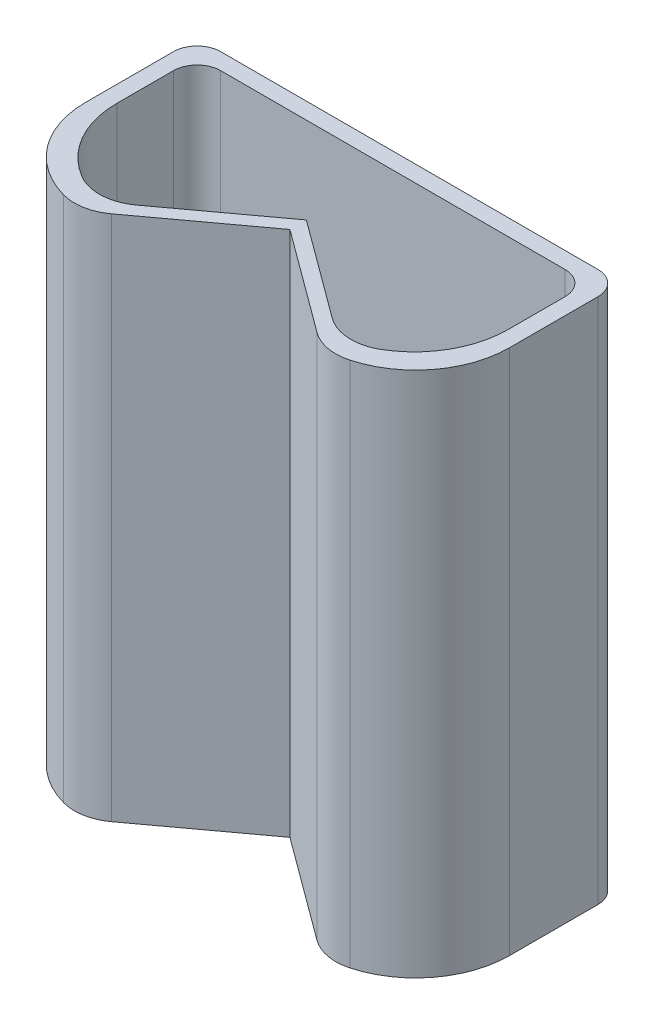
ISO-10303-21;
HEADER;
FILE_DESCRIPTION(('STEP AP214'),'2;1');
FILE_NAME('part.step','',(''),(''),'','','');
FILE_SCHEMA(('AUTOMOTIVE_DESIGN { 1 0 10303 214 1 1 1 1 }'));
ENDSEC;
DATA;
#1=APPLICATION_CONTEXT('core data for automotive mechanical design processes');
#2=APPLICATION_PROTOCOL_DEFINITION('international standard','automotive_design',2000,#1);
#3=PRODUCT_CONTEXT('',#1,'mechanical');
#4=PRODUCT('Part','Part','',(#3));
#5=PRODUCT_RELATED_PRODUCT_CATEGORY('part','',(#4));
#6=PRODUCT_DEFINITION_FORMATION('','',#4);
#7=PRODUCT_DEFINITION_CONTEXT('part definition',#1,'design');
#8=PRODUCT_DEFINITION('design','',#6,#7);
#9=PRODUCT_DEFINITION_SHAPE('','',#8);
#10=(LENGTH_UNIT() NAMED_UNIT(*) SI_UNIT(.MILLI.,.METRE.));
#11=(NAMED_UNIT(*) PLANE_ANGLE_UNIT() SI_UNIT($,.RADIAN.));
#12=(NAMED_UNIT(*) SI_UNIT($,.STERADIAN.) SOLID_ANGLE_UNIT());
#13=UNCERTAINTY_MEASURE_WITH_UNIT(LENGTH_MEASURE(1.E-05),#10,'distance_accuracy_value','');
#14=(GEOMETRIC_REPRESENTATION_CONTEXT(3) GLOBAL_UNCERTAINTY_ASSIGNED_CONTEXT((#13)) GLOBAL_UNIT_ASSIGNED_CONTEXT((#10,
#11,#12)) REPRESENTATION_CONTEXT('',''));
#15=CARTESIAN_POINT('',(0.,0.,0.));
#16=DIRECTION('',(0.,0.,1.));
#17=DIRECTION('',(1.,0.,0.));
#18=AXIS2_PLACEMENT_3D('',#15,#16,#17);
#19=CARTESIAN_POINT('',(-4.515,5.6,4.38));
#20=DIRECTION('',(0.,-1.,0.));
#21=DIRECTION('',(0.,0.,-1.));
#22=AXIS2_PLACEMENT_3D('',#19,#20,#21);
#23=PLANE('',#22);
#24=DIRECTION('',(0.805379604303526,0.,0.592759388767395));
#25=VECTOR('',#24,1.);
#26=CARTESIAN_POINT('',(-1.04549794512018,5.6,1.42051351239155));
#27=LINE('',#26,#25);
#28=CARTESIAN_POINT('',(0.,5.6,2.19));
#29=VERTEX_POINT('',#28);
#30=CARTESIAN_POINT('',(2.08320383743881,5.6,3.72323802435497));
#31=VERTEX_POINT('',#30);
#32=EDGE_CURVE('E250',#29,#31,#27,.T.);
#33=ORIENTED_EDGE('',*,*,#32,.F.);
#34=DIRECTION('',(0.805379604303526,0.,-0.592759388767395));
#35=VECTOR('',#34,1.);
#36=CARTESIAN_POINT('',(1.04549794512018,5.6,1.42051351239155));
#37=LINE('',#36,#35);
#38=CARTESIAN_POINT('',(-2.08320383743881,5.6,3.72323802435497));
#39=VERTEX_POINT('',#38);
#40=EDGE_CURVE('E247',#39,#29,#37,.T.);
#41=ORIENTED_EDGE('',*,*,#40,.F.);
#42=CARTESIAN_POINT('',(-2.67596322620621,5.6,2.91785842005144));
#43=DIRECTION('',(0.,-1.,0.));
#44=DIRECTION('',(0.,0.,-1.));
#45=AXIS2_PLACEMENT_3D('',#42,#43,#44);
#46=CIRCLE('',#45,1.);
#47=CARTESIAN_POINT('',(-3.18692645241241,5.6,3.77746099186294));
#48=VERTEX_POINT('',#47);
#49=EDGE_CURVE('E425',#39,#48,#46,.T.);
#50=ORIENTED_EDGE('',*,*,#49,.T.);
#51=CARTESIAN_POINT('',(-2.165,5.6,2.05825584823994));
#52=DIRECTION('',(0.,-1.,0.));
#53=DIRECTION('',(0.,0.,-1.));
#54=AXIS2_PLACEMENT_3D('',#51,#52,#53);
#55=CIRCLE('',#54,2.);
#56=CARTESIAN_POINT('',(-4.165,5.6,2.05825584823994));
#57=VERTEX_POINT('',#56);
#58=EDGE_CURVE('E362',#48,#57,#55,.T.);
#59=ORIENTED_EDGE('',*,*,#58,.T.);
#60=DIRECTION('',(0.,0.,-1.));
#61=VECTOR('',#60,1.);
#62=CARTESIAN_POINT('',(-4.165,5.6,0.));
#63=LINE('',#62,#61);
#64=CARTESIAN_POINT('',(-4.165,5.6,0.85));
#65=VERTEX_POINT('',#64);
#66=EDGE_CURVE('E263',#57,#65,#63,.T.);
#67=ORIENTED_EDGE('',*,*,#66,.T.);
#68=CARTESIAN_POINT('',(-3.665,5.6,0.85));
#69=DIRECTION('',(0.,-1.,0.));
#70=DIRECTION('',(0.,0.,-1.));
#71=AXIS2_PLACEMENT_3D('',#68,#69,#70);
#72=CIRCLE('',#71,0.5);
#73=CARTESIAN_POINT('',(-3.665,5.6,0.35));
#74=VERTEX_POINT('',#73);
#75=EDGE_CURVE('E79',#65,#74,#72,.T.);
#76=ORIENTED_EDGE('',*,*,#75,.T.);
#77=DIRECTION('',(1.,0.,0.));
#78=VECTOR('',#77,1.);
#79=CARTESIAN_POINT('',(0.,5.6,0.35));
#80=LINE('',#79,#78);
#81=CARTESIAN_POINT('',(3.665,5.6,0.35));
#82=VERTEX_POINT('',#81);
#83=EDGE_CURVE('E259',#74,#82,#80,.T.);
#84=ORIENTED_EDGE('',*,*,#83,.T.);
#85=CARTESIAN_POINT('',(3.665,5.6,0.85));
#86=DIRECTION('',(0.,-1.,0.));
#87=DIRECTION('',(0.,0.,-1.));
#88=AXIS2_PLACEMENT_3D('',#85,#86,#87);
#89=CIRCLE('',#88,0.5);
#90=CARTESIAN_POINT('',(4.165,5.6,0.85));
#91=VERTEX_POINT('',#90);
#92=EDGE_CURVE('E444',#82,#91,#89,.T.);
#93=ORIENTED_EDGE('',*,*,#92,.T.);
#94=DIRECTION('',(0.,0.,1.));
#95=VECTOR('',#94,1.);
#96=CARTESIAN_POINT('',(4.165,5.6,0.));
#97=LINE('',#96,#95);
#98=CARTESIAN_POINT('',(4.165,5.6,2.05825584823994));
#99=VERTEX_POINT('',#98);
#100=EDGE_CURVE('E256',#91,#99,#97,.T.);
#101=ORIENTED_EDGE('',*,*,#100,.T.);
#102=CARTESIAN_POINT('',(2.165,5.6,2.05825584823994));
#103=DIRECTION('',(0.,-1.,0.));
#104=DIRECTION('',(0.,0.,-1.));
#105=AXIS2_PLACEMENT_3D('',#102,#103,#104);
#106=CIRCLE('',#105,2.);
#107=CARTESIAN_POINT('',(3.18692645241241,5.6,3.77746099186294));
#108=VERTEX_POINT('',#107);
#109=EDGE_CURVE('E354',#99,#108,#106,.T.);
#110=ORIENTED_EDGE('',*,*,#109,.T.);
#111=CARTESIAN_POINT('',(2.67596322620621,5.6,2.91785842005144));
#112=DIRECTION('',(0.,-1.,0.));
#113=DIRECTION('',(0.,0.,-1.));
#114=AXIS2_PLACEMENT_3D('',#111,#112,#113);
#115=CIRCLE('',#114,1.);
#116=EDGE_CURVE('E419',#108,#31,#115,.T.);
#117=ORIENTED_EDGE('',*,*,#116,.T.);
#118=EDGE_LOOP('',(#33,#41,#50,#59,#67,#76,#84,#93,#101,#110,#117));
#119=FACE_BOUND('',#118,.T.);
#120=DIRECTION('',(-0.805379604303527,0.,-0.592759388767395));
#121=VECTOR('',#120,1.);
#122=CARTESIAN_POINT('',(-1.21258665781062,5.6,1.64753621985139));
#123=LINE('',#122,#121);
#124=CARTESIAN_POINT('',(2.18706145914825,5.6,4.14967723393311));
#125=VERTEX_POINT('',#124);
#126=CARTESIAN_POINT('',(0.,5.6,2.54));
#127=VERTEX_POINT('',#126);
#128=EDGE_CURVE('E222',#125,#127,#123,.T.);
#129=ORIENTED_EDGE('',*,*,#128,.F.);
#130=CARTESIAN_POINT('',(2.77982084791565,5.6,3.34429762962959));
#131=DIRECTION('',(0.,-1.,0.));
#132=DIRECTION('',(0.,0.,-1.));
#133=AXIS2_PLACEMENT_3D('',#130,#131,#132);
#134=CIRCLE('',#133,1.);
#135=CARTESIAN_POINT('',(3.0446416958313,5.6,4.30859525925917));
#136=VERTEX_POINT('',#135);
#137=EDGE_CURVE('E403',#125,#136,#134,.F.);
#138=ORIENTED_EDGE('',*,*,#137,.T.);
#139=CARTESIAN_POINT('',(2.515,5.6,2.38));
#140=DIRECTION('',(0.,-1.,0.));
#141=DIRECTION('',(0.,0.,-1.));
#142=AXIS2_PLACEMENT_3D('',#139,#140,#141);
#143=CIRCLE('',#142,2.);
#144=CARTESIAN_POINT('',(4.515,5.6,2.38));
#145=VERTEX_POINT('',#144);
#146=EDGE_CURVE('E372',#136,#145,#143,.F.);
#147=ORIENTED_EDGE('',*,*,#146,.T.);
#148=DIRECTION('',(0.,0.,-1.));
#149=VECTOR('',#148,1.);
#150=CARTESIAN_POINT('',(4.515,5.6,4.38));
#151=LINE('',#150,#149);
#152=CARTESIAN_POINT('',(4.515,5.6,0.5));
#153=VERTEX_POINT('',#152);
#154=EDGE_CURVE('E293',#145,#153,#151,.T.);
#155=ORIENTED_EDGE('',*,*,#154,.T.);
#156=CARTESIAN_POINT('',(4.015,5.6,0.5));
#157=DIRECTION('',(0.,-1.,0.));
#158=DIRECTION('',(0.,0.,-1.));
#159=AXIS2_PLACEMENT_3D('',#156,#157,#158);
#160=CIRCLE('',#159,0.5);
#161=CARTESIAN_POINT('',(4.015,5.6,0.));
#162=VERTEX_POINT('',#161);
#163=EDGE_CURVE('E304',#153,#162,#160,.F.);
#164=ORIENTED_EDGE('',*,*,#163,.T.);
#165=DIRECTION('',(-1.,0.,0.));
#166=VECTOR('',#165,1.);
#167=CARTESIAN_POINT('',(-4.515,5.6,0.));
#168=LINE('',#167,#166);
#169=CARTESIAN_POINT('',(-4.015,5.6,0.));
#170=VERTEX_POINT('',#169);
#171=EDGE_CURVE('E276',#162,#170,#168,.T.);
#172=ORIENTED_EDGE('',*,*,#171,.T.);
#173=CARTESIAN_POINT('',(-4.015,5.6,0.5));
#174=DIRECTION('',(0.,-1.,0.));
#175=DIRECTION('',(0.,0.,-1.));
#176=AXIS2_PLACEMENT_3D('',#173,#174,#175);
#177=CIRCLE('',#176,0.5);
#178=CARTESIAN_POINT('',(-4.515,5.6,0.5));
#179=VERTEX_POINT('',#178);
#180=EDGE_CURVE('E300',#170,#179,#177,.F.);
#181=ORIENTED_EDGE('',*,*,#180,.T.);
#182=DIRECTION('',(0.,0.,-1.));
#183=VECTOR('',#182,1.);
#184=CARTESIAN_POINT('',(-4.515,5.6,4.38));
#185=LINE('',#184,#183);
#186=CARTESIAN_POINT('',(-4.515,5.6,2.38));
#187=VERTEX_POINT('',#186);
#188=EDGE_CURVE('E290',#187,#179,#185,.T.);
#189=ORIENTED_EDGE('',*,*,#188,.F.);
#190=CARTESIAN_POINT('',(-2.515,5.6,2.38));
#191=DIRECTION('',(0.,-1.,0.));
#192=DIRECTION('',(0.,0.,-1.));
#193=AXIS2_PLACEMENT_3D('',#190,#191,#192);
#194=CIRCLE('',#193,2.);
#195=CARTESIAN_POINT('',(-3.04464169583129,5.6,4.30859525925917));
#196=VERTEX_POINT('',#195);
#197=EDGE_CURVE('E369',#187,#196,#194,.F.);
#198=ORIENTED_EDGE('',*,*,#197,.T.);
#199=CARTESIAN_POINT('',(-2.77982084791565,5.6,3.34429762962959));
#200=DIRECTION('',(0.,-1.,0.));
#201=DIRECTION('',(0.,0.,-1.));
#202=AXIS2_PLACEMENT_3D('',#199,#200,#201);
#203=CIRCLE('',#202,1.);
#204=CARTESIAN_POINT('',(-2.18706145914825,5.6,4.14967723393311));
#205=VERTEX_POINT('',#204);
#206=EDGE_CURVE('E226',#196,#205,#203,.F.);
#207=ORIENTED_EDGE('',*,*,#206,.T.);
#208=DIRECTION('',(0.805379604303526,0.,-0.592759388767395));
#209=VECTOR('',#208,1.);
#210=CARTESIAN_POINT('',(1.21258665781062,5.6,1.64753621985138));
#211=LINE('',#210,#209);
#212=EDGE_CURVE('E220',#205,#127,#211,.T.);
#213=ORIENTED_EDGE('',*,*,#212,.T.);
#214=EDGE_LOOP('',(#129,#138,#147,#155,#164,#172,#181,#189,#198,#207,#213));
#215=FACE_BOUND('',#214,.T.);
#216=ADVANCED_FACE('F70',(#119,#215),#23,.F.);
#217=CARTESIAN_POINT('',(-4.515,-5.6,4.38));
#218=DIRECTION('',(0.,1.,0.));
#219=DIRECTION('',(0.,0.,1.));
#220=AXIS2_PLACEMENT_3D('',#217,#218,#219);
#221=PLANE('',#220);
#222=DIRECTION('',(0.,0.,-1.));
#223=VECTOR('',#222,1.);
#224=CARTESIAN_POINT('',(-4.165,-5.6,4.38));
#225=LINE('',#224,#223);
#226=CARTESIAN_POINT('',(-4.165,-5.6,2.05825584823994));
#227=VERTEX_POINT('',#226);
#228=CARTESIAN_POINT('',(-4.165,-5.6,0.85));
#229=VERTEX_POINT('',#228);
#230=EDGE_CURVE('E335',#227,#229,#225,.T.);
#231=ORIENTED_EDGE('',*,*,#230,.F.);
#232=CARTESIAN_POINT('',(-2.165,-5.6,2.05825584823994));
#233=DIRECTION('',(0.,1.,0.));
#234=DIRECTION('',(0.,0.,1.));
#235=AXIS2_PLACEMENT_3D('',#232,#233,#234);
#236=CIRCLE('',#235,2.);
#237=CARTESIAN_POINT('',(-3.18692645241241,-5.6,3.77746099186294));
#238=VERTEX_POINT('',#237);
#239=EDGE_CURVE('E365',#227,#238,#236,.T.);
#240=ORIENTED_EDGE('',*,*,#239,.T.);
#241=CARTESIAN_POINT('',(-2.67596322620621,-5.6,2.91785842005144));
#242=DIRECTION('',(0.,1.,0.));
#243=DIRECTION('',(0.,0.,1.));
#244=AXIS2_PLACEMENT_3D('',#241,#242,#243);
#245=CIRCLE('',#244,1.);
#246=CARTESIAN_POINT('',(-2.08320383743881,-5.6,3.72323802435497));
#247=VERTEX_POINT('',#246);
#248=EDGE_CURVE('E428',#238,#247,#245,.T.);
#249=ORIENTED_EDGE('',*,*,#248,.T.);
#250=DIRECTION('',(0.805379604303526,0.,-0.592759388767395));
#251=VECTOR('',#250,1.);
#252=CARTESIAN_POINT('',(-3.97409087135207,-5.6,5.11493088131512));
#253=LINE('',#252,#251);
#254=CARTESIAN_POINT('',(0.,-5.6,2.19));
#255=VERTEX_POINT('',#254);
#256=EDGE_CURVE('E338',#247,#255,#253,.T.);
#257=ORIENTED_EDGE('',*,*,#256,.T.);
#258=DIRECTION('',(0.805379604303526,0.,0.592759388767395));
#259=VECTOR('',#258,1.);
#260=CARTESIAN_POINT('',(-1.88309498111171,-5.6,0.80404209390178));
#261=LINE('',#260,#259);
#262=CARTESIAN_POINT('',(2.08320383743881,-5.6,3.72323802435497));
#263=VERTEX_POINT('',#262);
#264=EDGE_CURVE('E324',#255,#263,#261,.T.);
#265=ORIENTED_EDGE('',*,*,#264,.T.);
#266=CARTESIAN_POINT('',(2.67596322620621,-5.6,2.91785842005144));
#267=DIRECTION('',(0.,1.,0.));
#268=DIRECTION('',(0.,0.,1.));
#269=AXIS2_PLACEMENT_3D('',#266,#267,#268);
#270=CIRCLE('',#269,1.);
#271=CARTESIAN_POINT('',(3.18692645241241,-5.6,3.77746099186294));
#272=VERTEX_POINT('',#271);
#273=EDGE_CURVE('E422',#263,#272,#270,.T.);
#274=ORIENTED_EDGE('',*,*,#273,.T.);
#275=CARTESIAN_POINT('',(2.165,-5.6,2.05825584823994));
#276=DIRECTION('',(0.,1.,0.));
#277=DIRECTION('',(0.,0.,1.));
#278=AXIS2_PLACEMENT_3D('',#275,#276,#277);
#279=CIRCLE('',#278,2.);
#280=CARTESIAN_POINT('',(4.165,-5.6,2.05825584823994));
#281=VERTEX_POINT('',#280);
#282=EDGE_CURVE('E358',#272,#281,#279,.T.);
#283=ORIENTED_EDGE('',*,*,#282,.T.);
#284=DIRECTION('',(0.,0.,1.));
#285=VECTOR('',#284,1.);
#286=CARTESIAN_POINT('',(4.165,-5.6,4.38));
#287=LINE('',#286,#285);
#288=CARTESIAN_POINT('',(4.165,-5.6,0.85));
#289=VERTEX_POINT('',#288);
#290=EDGE_CURVE('E328',#289,#281,#287,.T.);
#291=ORIENTED_EDGE('',*,*,#290,.F.);
#292=CARTESIAN_POINT('',(3.665,-5.6,0.85));
#293=DIRECTION('',(0.,1.,0.));
#294=DIRECTION('',(0.,0.,1.));
#295=AXIS2_PLACEMENT_3D('',#292,#293,#294);
#296=CIRCLE('',#295,0.5);
#297=CARTESIAN_POINT('',(3.665,-5.6,0.35));
#298=VERTEX_POINT('',#297);
#299=EDGE_CURVE('E447',#289,#298,#296,.T.);
#300=ORIENTED_EDGE('',*,*,#299,.T.);
#301=DIRECTION('',(1.,0.,0.));
#302=VECTOR('',#301,1.);
#303=CARTESIAN_POINT('',(-4.515,-5.6,0.35));
#304=LINE('',#303,#302);
#305=CARTESIAN_POINT('',(-3.665,-5.6,0.35));
#306=VERTEX_POINT('',#305);
#307=EDGE_CURVE('E331',#306,#298,#304,.T.);
#308=ORIENTED_EDGE('',*,*,#307,.F.);
#309=CARTESIAN_POINT('',(-3.665,-5.6,0.85));
#310=DIRECTION('',(0.,1.,0.));
#311=DIRECTION('',(0.,0.,1.));
#312=AXIS2_PLACEMENT_3D('',#309,#310,#311);
#313=CIRCLE('',#312,0.5);
#314=EDGE_CURVE('E12',#306,#229,#313,.T.);
#315=ORIENTED_EDGE('',*,*,#314,.T.);
#316=EDGE_LOOP('',(#231,#240,#249,#257,#265,#274,#283,#291,#300,#308,#315));
#317=FACE_BOUND('',#316,.T.);
#318=CARTESIAN_POINT('',(2.515,-5.6,2.38));
#319=DIRECTION('',(0.,1.,0.));
#320=DIRECTION('',(0.,0.,1.));
#321=AXIS2_PLACEMENT_3D('',#318,#319,#320);
#322=CIRCLE('',#321,2.);
#323=CARTESIAN_POINT('',(4.515,-5.6,2.38));
#324=VERTEX_POINT('',#323);
#325=CARTESIAN_POINT('',(3.0446416958313,-5.6,4.30859525925917));
#326=VERTEX_POINT('',#325);
#327=EDGE_CURVE('E378',#324,#326,#322,.F.);
#328=ORIENTED_EDGE('',*,*,#327,.T.);
#329=CARTESIAN_POINT('',(2.77982084791565,-5.6,3.34429762962959));
#330=DIRECTION('',(0.,1.,0.));
#331=DIRECTION('',(0.,0.,1.));
#332=AXIS2_PLACEMENT_3D('',#329,#330,#331);
#333=CIRCLE('',#332,1.);
#334=CARTESIAN_POINT('',(2.18706145914825,-5.6,4.14967723393311));
#335=VERTEX_POINT('',#334);
#336=EDGE_CURVE('E396',#326,#335,#333,.F.);
#337=ORIENTED_EDGE('',*,*,#336,.T.);
#338=DIRECTION('',(-0.805379604303527,0.,-0.592759388767395));
#339=VECTOR('',#338,1.);
#340=CARTESIAN_POINT('',(-2.05018369380215,-5.6,1.03106480136162));
#341=LINE('',#340,#339);
#342=CARTESIAN_POINT('',(0.,-5.6,2.54));
#343=VERTEX_POINT('',#342);
#344=EDGE_CURVE('E271',#335,#343,#341,.T.);
#345=ORIENTED_EDGE('',*,*,#344,.T.);
#346=DIRECTION('',(0.805379604303526,0.,-0.592759388767395));
#347=VECTOR('',#346,1.);
#348=CARTESIAN_POINT('',(-3.80700215866163,-5.6,5.34195358877496));
#349=LINE('',#348,#347);
#350=CARTESIAN_POINT('',(-2.18706145914825,-5.6,4.14967723393311));
#351=VERTEX_POINT('',#350);
#352=EDGE_CURVE('E244',#351,#343,#349,.T.);
#353=ORIENTED_EDGE('',*,*,#352,.F.);
#354=CARTESIAN_POINT('',(-2.77982084791565,-5.6,3.34429762962959));
#355=DIRECTION('',(0.,1.,0.));
#356=DIRECTION('',(0.,0.,1.));
#357=AXIS2_PLACEMENT_3D('',#354,#355,#356);
#358=CIRCLE('',#357,1.);
#359=CARTESIAN_POINT('',(-3.04464169583129,-5.6,4.30859525925917));
#360=VERTEX_POINT('',#359);
#361=EDGE_CURVE('E393',#351,#360,#358,.F.);
#362=ORIENTED_EDGE('',*,*,#361,.T.);
#363=CARTESIAN_POINT('',(-2.515,-5.6,2.38));
#364=DIRECTION('',(0.,1.,0.));
#365=DIRECTION('',(0.,0.,1.));
#366=AXIS2_PLACEMENT_3D('',#363,#364,#365);
#367=CIRCLE('',#366,2.);
#368=CARTESIAN_POINT('',(-4.515,-5.6,2.38));
#369=VERTEX_POINT('',#368);
#370=EDGE_CURVE('E375',#360,#369,#367,.F.);
#371=ORIENTED_EDGE('',*,*,#370,.T.);
#372=DIRECTION('',(0.,0.,-1.));
#373=VECTOR('',#372,1.);
#374=CARTESIAN_POINT('',(-4.515,-5.6,4.38));
#375=LINE('',#374,#373);
#376=CARTESIAN_POINT('',(-4.515,-5.6,0.5));
#377=VERTEX_POINT('',#376);
#378=EDGE_CURVE('E287',#369,#377,#375,.T.);
#379=ORIENTED_EDGE('',*,*,#378,.T.);
#380=CARTESIAN_POINT('',(-4.015,-5.6,0.5));
#381=DIRECTION('',(0.,1.,0.));
#382=DIRECTION('',(0.,0.,1.));
#383=AXIS2_PLACEMENT_3D('',#380,#381,#382);
#384=CIRCLE('',#383,0.5);
#385=CARTESIAN_POINT('',(-4.015,-5.6,0.));
#386=VERTEX_POINT('',#385);
#387=EDGE_CURVE('E313',#377,#386,#384,.F.);
#388=ORIENTED_EDGE('',*,*,#387,.T.);
#389=DIRECTION('',(1.,0.,0.));
#390=VECTOR('',#389,1.);
#391=CARTESIAN_POINT('',(-4.515,-5.6,0.));
#392=LINE('',#391,#390);
#393=CARTESIAN_POINT('',(4.015,-5.6,0.));
#394=VERTEX_POINT('',#393);
#395=EDGE_CURVE('E280',#386,#394,#392,.T.);
#396=ORIENTED_EDGE('',*,*,#395,.T.);
#397=CARTESIAN_POINT('',(4.015,-5.6,0.5));
#398=DIRECTION('',(0.,1.,0.));
#399=DIRECTION('',(0.,0.,1.));
#400=AXIS2_PLACEMENT_3D('',#397,#398,#399);
#401=CIRCLE('',#400,0.5);
#402=CARTESIAN_POINT('',(4.515,-5.6,0.5));
#403=VERTEX_POINT('',#402);
#404=EDGE_CURVE('E316',#394,#403,#401,.F.);
#405=ORIENTED_EDGE('',*,*,#404,.T.);
#406=DIRECTION('',(0.,0.,-1.));
#407=VECTOR('',#406,1.);
#408=CARTESIAN_POINT('',(4.515,-5.6,4.38));
#409=LINE('',#408,#407);
#410=EDGE_CURVE('E284',#324,#403,#409,.T.);
#411=ORIENTED_EDGE('',*,*,#410,.F.);
#412=EDGE_LOOP('',(#328,#337,#345,#353,#362,#371,#379,#388,#396,#405,#411));
#413=FACE_BOUND('',#412,.T.);
#414=ADVANCED_FACE('F461',(#317,#413),#221,.F.);
#415=CARTESIAN_POINT('',(4.515,-5.6,4.38));
#416=DIRECTION('',(-1.,0.,0.));
#417=DIRECTION('',(0.,0.,1.));
#418=AXIS2_PLACEMENT_3D('',#415,#416,#417);
#419=PLANE('',#418);
#420=ORIENTED_EDGE('',*,*,#154,.F.);
#421=DIRECTION('',(0.,1.,0.));
#422=VECTOR('',#421,1.);
#423=CARTESIAN_POINT('',(4.515,-5.6,2.38));
#424=LINE('',#423,#422);
#425=EDGE_CURVE('E345',#145,#324,#424,.F.);
#426=ORIENTED_EDGE('',*,*,#425,.T.);
#427=ORIENTED_EDGE('',*,*,#410,.T.);
#428=DIRECTION('',(0.,1.,0.));
#429=VECTOR('',#428,1.);
#430=CARTESIAN_POINT('',(4.515,5.6,0.5));
#431=LINE('',#430,#429);
#432=EDGE_CURVE('E296',#403,#153,#431,.T.);
#433=ORIENTED_EDGE('',*,*,#432,.T.);
#434=EDGE_LOOP('',(#420,#426,#427,#433));
#435=FACE_BOUND('',#434,.T.);
#436=ADVANCED_FACE('F510',(#435),#419,.F.);
#437=CARTESIAN_POINT('',(-4.515,-5.6,4.38));
#438=DIRECTION('',(1.,0.,0.));
#439=DIRECTION('',(0.,0.,-1.));
#440=AXIS2_PLACEMENT_3D('',#437,#438,#439);
#441=PLANE('',#440);
#442=ORIENTED_EDGE('',*,*,#378,.F.);
#443=DIRECTION('',(0.,-1.,0.));
#444=VECTOR('',#443,1.);
#445=CARTESIAN_POINT('',(-4.515,-5.6,2.38));
#446=LINE('',#445,#444);
#447=EDGE_CURVE('E351',#369,#187,#446,.F.);
#448=ORIENTED_EDGE('',*,*,#447,.T.);
#449=ORIENTED_EDGE('',*,*,#188,.T.);
#450=DIRECTION('',(0.,-1.,0.));
#451=VECTOR('',#450,1.);
#452=CARTESIAN_POINT('',(-4.515,-5.6,0.5));
#453=LINE('',#452,#451);
#454=EDGE_CURVE('E320',#179,#377,#453,.T.);
#455=ORIENTED_EDGE('',*,*,#454,.T.);
#456=EDGE_LOOP('',(#442,#448,#449,#455));
#457=FACE_BOUND('',#456,.T.);
#458=ADVANCED_FACE('F514',(#457),#441,.F.);
#459=CARTESIAN_POINT('',(0.,0.,0.));
#460=DIRECTION('',(0.,0.,-1.));
#461=DIRECTION('',(-1.,0.,0.));
#462=AXIS2_PLACEMENT_3D('',#459,#460,#461);
#463=PLANE('',#462);
#464=ORIENTED_EDGE('',*,*,#171,.F.);
#465=DIRECTION('',(0.,1.,0.));
#466=VECTOR('',#465,1.);
#467=CARTESIAN_POINT('',(4.015,-5.6,0.));
#468=LINE('',#467,#466);
#469=EDGE_CURVE('E310',#162,#394,#468,.F.);
#470=ORIENTED_EDGE('',*,*,#469,.T.);
#471=ORIENTED_EDGE('',*,*,#395,.F.);
#472=DIRECTION('',(0.,-1.,0.));
#473=VECTOR('',#472,1.);
#474=CARTESIAN_POINT('',(-4.015,5.6,0.));
#475=LINE('',#474,#473);
#476=EDGE_CURVE('E307',#386,#170,#475,.F.);
#477=ORIENTED_EDGE('',*,*,#476,.T.);
#478=EDGE_LOOP('',(#464,#470,#471,#477));
#479=FACE_BOUND('',#478,.T.);
#480=ADVANCED_FACE('F522',(#479),#463,.T.);
#481=CARTESIAN_POINT('',(4.015,-5.6,0.5));
#482=DIRECTION('',(0.,-1.,0.));
#483=DIRECTION('',(0.,0.,-1.));
#484=AXIS2_PLACEMENT_3D('',#481,#482,#483);
#485=CYLINDRICAL_SURFACE('',#484,0.5);
#486=ORIENTED_EDGE('',*,*,#404,.F.);
#487=ORIENTED_EDGE('',*,*,#469,.F.);
#488=ORIENTED_EDGE('',*,*,#163,.F.);
#489=ORIENTED_EDGE('',*,*,#432,.F.);
#490=EDGE_LOOP('',(#486,#487,#488,#489));
#491=FACE_BOUND('',#490,.T.);
#492=ADVANCED_FACE('F518',(#491),#485,.T.);
#493=CARTESIAN_POINT('',(-4.015,-5.6,0.5));
#494=DIRECTION('',(0.,1.,0.));
#495=DIRECTION('',(0.,0.,1.));
#496=AXIS2_PLACEMENT_3D('',#493,#494,#495);
#497=CYLINDRICAL_SURFACE('',#496,0.5);
#498=ORIENTED_EDGE('',*,*,#180,.F.);
#499=ORIENTED_EDGE('',*,*,#476,.F.);
#500=ORIENTED_EDGE('',*,*,#387,.F.);
#501=ORIENTED_EDGE('',*,*,#454,.F.);
#502=EDGE_LOOP('',(#498,#499,#500,#501));
#503=FACE_BOUND('',#502,.T.);
#504=ADVANCED_FACE('F521',(#503),#497,.T.);
#505=CARTESIAN_POINT('',(1.21258665781062,-8.78,1.64753621985138));
#506=DIRECTION('',(0.592759388767395,0.,0.805379604303526));
#507=DIRECTION('',(0.805379604303526,0.,-0.592759388767395));
#508=AXIS2_PLACEMENT_3D('',#505,#506,#507);
#509=PLANE('',#508);
#510=ORIENTED_EDGE('',*,*,#212,.F.);
#511=DIRECTION('',(0.,-1.,0.));
#512=VECTOR('',#511,1.);
#513=CARTESIAN_POINT('',(-2.18706145914825,-8.78,4.14967723393311));
#514=LINE('',#513,#512);
#515=EDGE_CURVE('E406',#205,#351,#514,.T.);
#516=ORIENTED_EDGE('',*,*,#515,.T.);
#517=ORIENTED_EDGE('',*,*,#352,.T.);
#518=DIRECTION('',(0.,1.,0.));
#519=VECTOR('',#518,1.);
#520=CARTESIAN_POINT('',(0.,-8.78,2.54));
#521=LINE('',#520,#519);
#522=EDGE_CURVE('E232',#343,#127,#521,.T.);
#523=ORIENTED_EDGE('',*,*,#522,.T.);
#524=EDGE_LOOP('',(#510,#516,#517,#523));
#525=FACE_BOUND('',#524,.T.);
#526=ADVANCED_FACE('F242',(#525),#509,.T.);
#527=CARTESIAN_POINT('',(-1.21258665781062,-8.78,1.64753621985139));
#528=DIRECTION('',(0.592759388767395,0.,-0.805379604303526));
#529=DIRECTION('',(-0.805379604303527,0.,-0.592759388767395));
#530=AXIS2_PLACEMENT_3D('',#527,#528,#529);
#531=PLANE('',#530);
#532=ORIENTED_EDGE('',*,*,#344,.F.);
#533=DIRECTION('',(0.,-1.,0.));
#534=VECTOR('',#533,1.);
#535=CARTESIAN_POINT('',(2.18706145914825,5.6,4.14967723393311));
#536=LINE('',#535,#534);
#537=EDGE_CURVE('E239',#335,#125,#536,.F.);
#538=ORIENTED_EDGE('',*,*,#537,.T.);
#539=ORIENTED_EDGE('',*,*,#128,.T.);
#540=ORIENTED_EDGE('',*,*,#522,.F.);
#541=EDGE_LOOP('',(#532,#538,#539,#540));
#542=FACE_BOUND('',#541,.T.);
#543=ADVANCED_FACE('F237',(#542),#531,.F.);
#544=CARTESIAN_POINT('',(1.04549794512018,-8.78,1.42051351239155));
#545=DIRECTION('',(0.592759388767395,0.,0.805379604303526));
#546=DIRECTION('',(0.805379604303526,0.,-0.592759388767395));
#547=AXIS2_PLACEMENT_3D('',#544,#545,#546);
#548=PLANE('',#547);
#549=ORIENTED_EDGE('',*,*,#256,.F.);
#550=DIRECTION('',(0.,1.,0.));
#551=VECTOR('',#550,1.);
#552=CARTESIAN_POINT('',(-2.08320383743881,5.6,3.72323802435497));
#553=LINE('',#552,#551);
#554=EDGE_CURVE('E412',#247,#39,#553,.T.);
#555=ORIENTED_EDGE('',*,*,#554,.T.);
#556=ORIENTED_EDGE('',*,*,#40,.T.);
#557=DIRECTION('',(0.,1.,0.));
#558=VECTOR('',#557,1.);
#559=CARTESIAN_POINT('',(0.,-8.78,2.19));
#560=LINE('',#559,#558);
#561=EDGE_CURVE('E267',#255,#29,#560,.T.);
#562=ORIENTED_EDGE('',*,*,#561,.F.);
#563=EDGE_LOOP('',(#549,#555,#556,#562));
#564=FACE_BOUND('',#563,.T.);
#565=ADVANCED_FACE('F475',(#564),#548,.F.);
#566=CARTESIAN_POINT('',(-4.165,-8.78,0.));
#567=DIRECTION('',(1.,0.,0.));
#568=DIRECTION('',(0.,0.,-1.));
#569=AXIS2_PLACEMENT_3D('',#566,#567,#568);
#570=PLANE('',#569);
#571=ORIENTED_EDGE('',*,*,#230,.T.);
#572=DIRECTION('',(0.,1.,0.));
#573=VECTOR('',#572,1.);
#574=CARTESIAN_POINT('',(-4.165,5.6,0.85));
#575=LINE('',#574,#573);
#576=EDGE_CURVE('E441',#229,#65,#575,.T.);
#577=ORIENTED_EDGE('',*,*,#576,.T.);
#578=ORIENTED_EDGE('',*,*,#66,.F.);
#579=DIRECTION('',(0.,1.,0.));
#580=VECTOR('',#579,1.);
#581=CARTESIAN_POINT('',(-4.165,-5.6,2.05825584823994));
#582=LINE('',#581,#580);
#583=EDGE_CURVE('E348',#57,#227,#582,.F.);
#584=ORIENTED_EDGE('',*,*,#583,.T.);
#585=EDGE_LOOP('',(#571,#577,#578,#584));
#586=FACE_BOUND('',#585,.T.);
#587=ADVANCED_FACE('F458',(#586),#570,.T.);
#588=CARTESIAN_POINT('',(0.,-8.78,0.35));
#589=DIRECTION('',(0.,0.,1.));
#590=DIRECTION('',(1.,0.,0.));
#591=AXIS2_PLACEMENT_3D('',#588,#589,#590);
#592=PLANE('',#591);
#593=ORIENTED_EDGE('',*,*,#307,.T.);
#594=DIRECTION('',(0.,1.,0.));
#595=VECTOR('',#594,1.);
#596=CARTESIAN_POINT('',(3.665,5.6,0.35));
#597=LINE('',#596,#595);
#598=EDGE_CURVE('E434',#298,#82,#597,.T.);
#599=ORIENTED_EDGE('',*,*,#598,.T.);
#600=ORIENTED_EDGE('',*,*,#83,.F.);
#601=DIRECTION('',(0.,1.,0.));
#602=VECTOR('',#601,1.);
#603=CARTESIAN_POINT('',(-3.665,-5.6,0.35));
#604=LINE('',#603,#602);
#605=EDGE_CURVE('E431',#74,#306,#604,.F.);
#606=ORIENTED_EDGE('',*,*,#605,.T.);
#607=EDGE_LOOP('',(#593,#599,#600,#606));
#608=FACE_BOUND('',#607,.T.);
#609=ADVANCED_FACE('F455',(#608),#592,.T.);
#610=CARTESIAN_POINT('',(4.165,-8.78,0.));
#611=DIRECTION('',(-1.,0.,0.));
#612=DIRECTION('',(0.,0.,1.));
#613=AXIS2_PLACEMENT_3D('',#610,#611,#612);
#614=PLANE('',#613);
#615=ORIENTED_EDGE('',*,*,#100,.F.);
#616=DIRECTION('',(0.,1.,0.));
#617=VECTOR('',#616,1.);
#618=CARTESIAN_POINT('',(4.165,-5.6,0.85));
#619=LINE('',#618,#617);
#620=EDGE_CURVE('E438',#91,#289,#619,.F.);
#621=ORIENTED_EDGE('',*,*,#620,.T.);
#622=ORIENTED_EDGE('',*,*,#290,.T.);
#623=DIRECTION('',(0.,-1.,0.));
#624=VECTOR('',#623,1.);
#625=CARTESIAN_POINT('',(4.165,5.6,2.05825584823994));
#626=LINE('',#625,#624);
#627=EDGE_CURVE('E341',#281,#99,#626,.F.);
#628=ORIENTED_EDGE('',*,*,#627,.T.);
#629=EDGE_LOOP('',(#615,#621,#622,#628));
#630=FACE_BOUND('',#629,.T.);
#631=ADVANCED_FACE('F496',(#630),#614,.T.);
#632=CARTESIAN_POINT('',(-1.04549794512018,-8.78,1.42051351239155));
#633=DIRECTION('',(-0.592759388767395,0.,0.805379604303526));
#634=DIRECTION('',(0.805379604303526,0.,0.592759388767395));
#635=AXIS2_PLACEMENT_3D('',#632,#633,#634);
#636=PLANE('',#635);
#637=ORIENTED_EDGE('',*,*,#32,.T.);
#638=DIRECTION('',(0.,-1.,0.));
#639=VECTOR('',#638,1.);
#640=CARTESIAN_POINT('',(2.08320383743881,-5.6,3.72323802435497));
#641=LINE('',#640,#639);
#642=EDGE_CURVE('E386',#31,#263,#641,.T.);
#643=ORIENTED_EDGE('',*,*,#642,.T.);
#644=ORIENTED_EDGE('',*,*,#264,.F.);
#645=ORIENTED_EDGE('',*,*,#561,.T.);
#646=EDGE_LOOP('',(#637,#643,#644,#645));
#647=FACE_BOUND('',#646,.T.);
#648=ADVANCED_FACE('F478',(#647),#636,.F.);
#649=CARTESIAN_POINT('',(2.165,-8.78,2.05825584823994));
#650=DIRECTION('',(0.,1.,0.));
#651=DIRECTION('',(0.,0.,1.));
#652=AXIS2_PLACEMENT_3D('',#649,#650,#651);
#653=CYLINDRICAL_SURFACE('',#652,2.);
#654=ORIENTED_EDGE('',*,*,#282,.F.);
#655=DIRECTION('',(0.,1.,0.));
#656=VECTOR('',#655,1.);
#657=CARTESIAN_POINT('',(3.18692645241241,-8.78,3.77746099186294));
#658=LINE('',#657,#656);
#659=EDGE_CURVE('E382',#272,#108,#658,.T.);
#660=ORIENTED_EDGE('',*,*,#659,.T.);
#661=ORIENTED_EDGE('',*,*,#109,.F.);
#662=ORIENTED_EDGE('',*,*,#627,.F.);
#663=EDGE_LOOP('',(#654,#660,#661,#662));
#664=FACE_BOUND('',#663,.T.);
#665=ADVANCED_FACE('F487',(#664),#653,.F.);
#666=CARTESIAN_POINT('',(2.515,0.,2.38));
#667=DIRECTION('',(0.,1.,0.));
#668=DIRECTION('',(0.,0.,1.));
#669=AXIS2_PLACEMENT_3D('',#666,#667,#668);
#670=CYLINDRICAL_SURFACE('',#669,2.);
#671=ORIENTED_EDGE('',*,*,#146,.F.);
#672=DIRECTION('',(0.,1.,0.));
#673=VECTOR('',#672,1.);
#674=CARTESIAN_POINT('',(3.0446416958313,0.,4.30859525925917));
#675=LINE('',#674,#673);
#676=EDGE_CURVE('E389',#136,#326,#675,.F.);
#677=ORIENTED_EDGE('',*,*,#676,.T.);
#678=ORIENTED_EDGE('',*,*,#327,.F.);
#679=ORIENTED_EDGE('',*,*,#425,.F.);
#680=EDGE_LOOP('',(#671,#677,#678,#679));
#681=FACE_BOUND('',#680,.T.);
#682=ADVANCED_FACE('F529',(#681),#670,.T.);
#683=CARTESIAN_POINT('',(-2.165,-8.78,2.05825584823994));
#684=DIRECTION('',(0.,-1.,0.));
#685=DIRECTION('',(0.,0.,-1.));
#686=AXIS2_PLACEMENT_3D('',#683,#684,#685);
#687=CYLINDRICAL_SURFACE('',#686,2.);
#688=ORIENTED_EDGE('',*,*,#58,.F.);
#689=DIRECTION('',(0.,-1.,0.));
#690=VECTOR('',#689,1.);
#691=CARTESIAN_POINT('',(-3.18692645241241,-8.78,3.77746099186294));
#692=LINE('',#691,#690);
#693=EDGE_CURVE('E416',#48,#238,#692,.T.);
#694=ORIENTED_EDGE('',*,*,#693,.T.);
#695=ORIENTED_EDGE('',*,*,#239,.F.);
#696=ORIENTED_EDGE('',*,*,#583,.F.);
#697=EDGE_LOOP('',(#688,#694,#695,#696));
#698=FACE_BOUND('',#697,.T.);
#699=ADVANCED_FACE('F466',(#698),#687,.F.);
#700=CARTESIAN_POINT('',(-2.515,0.,2.38));
#701=DIRECTION('',(0.,-1.,0.));
#702=DIRECTION('',(0.,0.,-1.));
#703=AXIS2_PLACEMENT_3D('',#700,#701,#702);
#704=CYLINDRICAL_SURFACE('',#703,2.);
#705=ORIENTED_EDGE('',*,*,#370,.F.);
#706=DIRECTION('',(0.,-1.,0.));
#707=VECTOR('',#706,1.);
#708=CARTESIAN_POINT('',(-3.04464169583129,0.,4.30859525925917));
#709=LINE('',#708,#707);
#710=EDGE_CURVE('E409',#360,#196,#709,.F.);
#711=ORIENTED_EDGE('',*,*,#710,.T.);
#712=ORIENTED_EDGE('',*,*,#197,.F.);
#713=ORIENTED_EDGE('',*,*,#447,.F.);
#714=EDGE_LOOP('',(#705,#711,#712,#713));
#715=FACE_BOUND('',#714,.T.);
#716=ADVANCED_FACE('F535',(#715),#704,.T.);
#717=CARTESIAN_POINT('',(2.67596322620621,-8.78,2.91785842005144));
#718=DIRECTION('',(0.,1.,0.));
#719=DIRECTION('',(0.,0.,1.));
#720=AXIS2_PLACEMENT_3D('',#717,#718,#719);
#721=CYLINDRICAL_SURFACE('',#720,1.);
#722=ORIENTED_EDGE('',*,*,#273,.F.);
#723=ORIENTED_EDGE('',*,*,#642,.F.);
#724=ORIENTED_EDGE('',*,*,#116,.F.);
#725=ORIENTED_EDGE('',*,*,#659,.F.);
#726=EDGE_LOOP('',(#722,#723,#724,#725));
#727=FACE_BOUND('',#726,.T.);
#728=ADVANCED_FACE('F484',(#727),#721,.F.);
#729=CARTESIAN_POINT('',(2.77982084791565,0.,3.34429762962959));
#730=DIRECTION('',(0.,1.,0.));
#731=DIRECTION('',(0.,0.,1.));
#732=AXIS2_PLACEMENT_3D('',#729,#730,#731);
#733=CYLINDRICAL_SURFACE('',#732,1.);
#734=ORIENTED_EDGE('',*,*,#137,.F.);
#735=ORIENTED_EDGE('',*,*,#537,.F.);
#736=ORIENTED_EDGE('',*,*,#336,.F.);
#737=ORIENTED_EDGE('',*,*,#676,.F.);
#738=EDGE_LOOP('',(#734,#735,#736,#737));
#739=FACE_BOUND('',#738,.T.);
#740=ADVANCED_FACE('F541',(#739),#733,.T.);
#741=CARTESIAN_POINT('',(-2.77982084791565,0.,3.34429762962959));
#742=DIRECTION('',(0.,-1.,0.));
#743=DIRECTION('',(0.,0.,-1.));
#744=AXIS2_PLACEMENT_3D('',#741,#742,#743);
#745=CYLINDRICAL_SURFACE('',#744,1.);
#746=ORIENTED_EDGE('',*,*,#206,.F.);
#747=ORIENTED_EDGE('',*,*,#710,.F.);
#748=ORIENTED_EDGE('',*,*,#361,.F.);
#749=ORIENTED_EDGE('',*,*,#515,.F.);
#750=EDGE_LOOP('',(#746,#747,#748,#749));
#751=FACE_BOUND('',#750,.T.);
#752=ADVANCED_FACE('F544',(#751),#745,.T.);
#753=CARTESIAN_POINT('',(-2.67596322620621,-8.78,2.91785842005144));
#754=DIRECTION('',(0.,-1.,0.));
#755=DIRECTION('',(0.,0.,-1.));
#756=AXIS2_PLACEMENT_3D('',#753,#754,#755);
#757=CYLINDRICAL_SURFACE('',#756,1.);
#758=ORIENTED_EDGE('',*,*,#248,.F.);
#759=ORIENTED_EDGE('',*,*,#693,.F.);
#760=ORIENTED_EDGE('',*,*,#49,.F.);
#761=ORIENTED_EDGE('',*,*,#554,.F.);
#762=EDGE_LOOP('',(#758,#759,#760,#761));
#763=FACE_BOUND('',#762,.T.);
#764=ADVANCED_FACE('F469',(#763),#757,.F.);
#765=CARTESIAN_POINT('',(3.665,-8.78,0.85));
#766=DIRECTION('',(0.,-1.,0.));
#767=DIRECTION('',(0.,0.,-1.));
#768=AXIS2_PLACEMENT_3D('',#765,#766,#767);
#769=CYLINDRICAL_SURFACE('',#768,0.5);
#770=ORIENTED_EDGE('',*,*,#299,.F.);
#771=ORIENTED_EDGE('',*,*,#620,.F.);
#772=ORIENTED_EDGE('',*,*,#92,.F.);
#773=ORIENTED_EDGE('',*,*,#598,.F.);
#774=EDGE_LOOP('',(#770,#771,#772,#773));
#775=FACE_BOUND('',#774,.T.);
#776=ADVANCED_FACE('F494',(#775),#769,.F.);
#777=CARTESIAN_POINT('',(-3.665,-8.78,0.85));
#778=DIRECTION('',(0.,-1.,0.));
#779=DIRECTION('',(0.,0.,-1.));
#780=AXIS2_PLACEMENT_3D('',#777,#778,#779);
#781=CYLINDRICAL_SURFACE('',#780,0.5);
#782=ORIENTED_EDGE('',*,*,#314,.F.);
#783=ORIENTED_EDGE('',*,*,#605,.F.);
#784=ORIENTED_EDGE('',*,*,#75,.F.);
#785=ORIENTED_EDGE('',*,*,#576,.F.);
#786=EDGE_LOOP('',(#782,#783,#784,#785));
#787=FACE_BOUND('',#786,.T.);
#788=ADVANCED_FACE('F72',(#787),#781,.F.);
#789=CLOSED_SHELL('',(#216,#414,#436,#458,#480,#492,#504,#526,#543,#565,#587,#609,#631,#648,
#665,#682,#699,#716,#728,#740,#752,#764,#776,#788));
#790=MANIFOLD_SOLID_BREP('B2',#789);
#791=ADVANCED_BREP_SHAPE_REPRESENTATION('',(#18,#790),#14);
#792=SHAPE_DEFINITION_REPRESENTATION(#9,#791);
ENDSEC;
END-ISO-10303-21;
